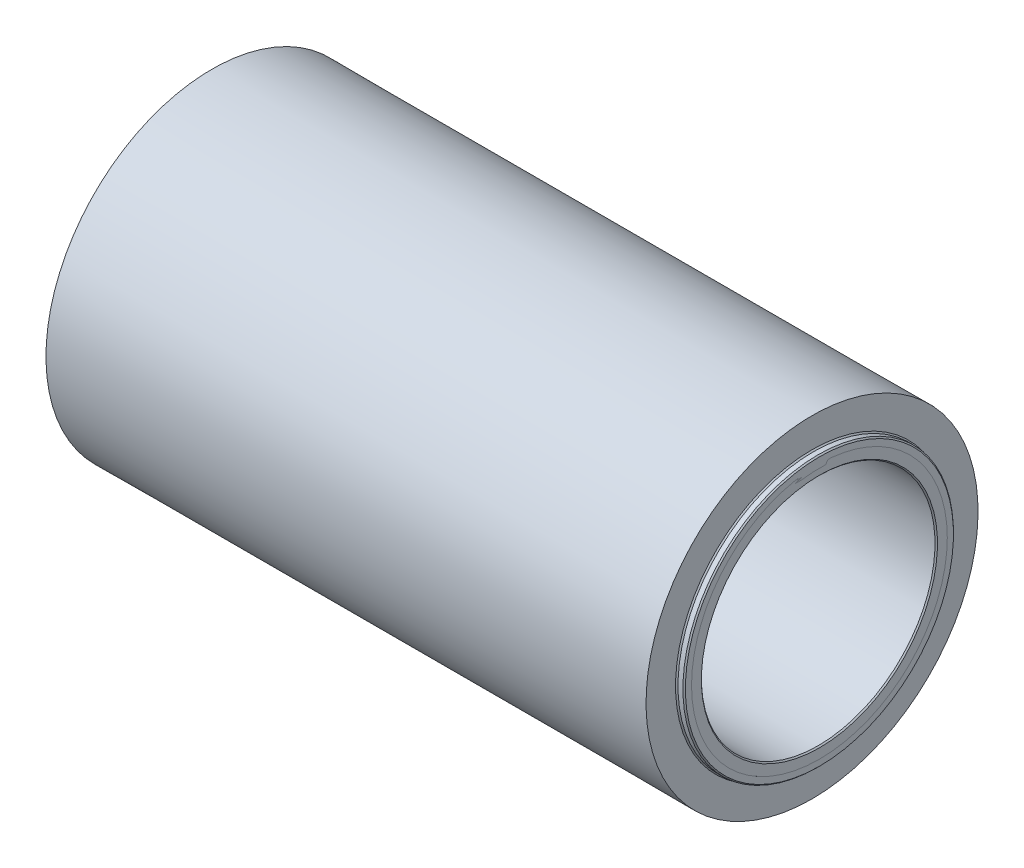
ISO-10303-21;
HEADER;
FILE_DESCRIPTION(('STEP AP214'),'2;1');
FILE_NAME('part.step','',(''),(''),'','','');
FILE_SCHEMA(('AUTOMOTIVE_DESIGN { 1 0 10303 214 1 1 1 1 }'));
ENDSEC;
DATA;
#1=APPLICATION_CONTEXT('core data for automotive mechanical design processes');
#2=APPLICATION_PROTOCOL_DEFINITION('international standard','automotive_design',2000,#1);
#3=PRODUCT_CONTEXT('',#1,'mechanical');
#4=PRODUCT('Part','Part','',(#3));
#5=PRODUCT_RELATED_PRODUCT_CATEGORY('part','',(#4));
#6=PRODUCT_DEFINITION_FORMATION('','',#4);
#7=PRODUCT_DEFINITION_CONTEXT('part definition',#1,'design');
#8=PRODUCT_DEFINITION('design','',#6,#7);
#9=PRODUCT_DEFINITION_SHAPE('','',#8);
#10=(LENGTH_UNIT() NAMED_UNIT(*) SI_UNIT(.MILLI.,.METRE.));
#11=(NAMED_UNIT(*) PLANE_ANGLE_UNIT() SI_UNIT($,.RADIAN.));
#12=(NAMED_UNIT(*) SI_UNIT($,.STERADIAN.) SOLID_ANGLE_UNIT());
#13=UNCERTAINTY_MEASURE_WITH_UNIT(LENGTH_MEASURE(1.E-05),#10,'distance_accuracy_value','');
#14=(GEOMETRIC_REPRESENTATION_CONTEXT(3) GLOBAL_UNCERTAINTY_ASSIGNED_CONTEXT((#13)) GLOBAL_UNIT_ASSIGNED_CONTEXT((#10,
#11,#12)) REPRESENTATION_CONTEXT('',''));
#15=CARTESIAN_POINT('',(0.,0.,0.));
#16=DIRECTION('',(0.,0.,1.));
#17=DIRECTION('',(1.,0.,0.));
#18=AXIS2_PLACEMENT_3D('',#15,#16,#17);
#19=CARTESIAN_POINT('',(-9.94738283618957E-05,0.000499963431931475,0.));
#20=DIRECTION('',(-0.999999999951495,9.84939010936225E-06,0.));
#21=DIRECTION('',(-9.84939010936225E-06,-0.999999999951495,0.));
#22=AXIS2_PLACEMENT_3D('',#19,#20,#21);
#23=CONICAL_SURFACE('',#22,10.0995000369476,0.785388314007278);
#24=CARTESIAN_POINT('',(0.0999015109905896,0.000498978483220625,0.));
#25=DIRECTION('',(-0.999999999951495,9.84939010936225E-06,0.));
#26=DIRECTION('',(-9.84939010936225E-06,-0.999999999951495,0.));
#27=AXIS2_PLACEMENT_3D('',#24,#25,#26);
#28=CIRCLE('',#27,9.99950102200182);
#29=CARTESIAN_POINT('',(0.0998030220041249,-9.99900204303357,0.));
#30=VERTEX_POINT('',#29);
#31=EDGE_CURVE('E104',#30,#30,#28,.T.);
#32=ORIENTED_EDGE('',*,*,#31,.F.);
#33=EDGE_LOOP('',(#32));
#34=FACE_BOUND('',#33,.T.);
#35=CARTESIAN_POINT('',(-9.94738283618957E-05,0.000499963431931475,0.));
#36=DIRECTION('',(-0.999999999951495,9.84939010936225E-06,0.));
#37=DIRECTION('',(-9.84939010936225E-06,-0.999999999951495,0.));
#38=AXIS2_PLACEMENT_3D('',#35,#36,#37);
#39=CIRCLE('',#38,10.0995000369476);
#40=CARTESIAN_POINT('',(-0.000198947744135311,-10.0990000730258,0.));
#41=VERTEX_POINT('',#40);
#42=EDGE_CURVE('E11',#41,#41,#39,.T.);
#43=ORIENTED_EDGE('',*,*,#42,.T.);
#44=EDGE_LOOP('',(#43));
#45=FACE_BOUND('',#44,.T.);
#46=ADVANCED_FACE('F45',(#34,#45),#23,.F.);
#47=CARTESIAN_POINT('',(-3.9396686253308E-06,10.0999999999284,0.));
#48=DIRECTION('',(0.999999999951495,-9.84939010936225E-06,0.));
#49=DIRECTION('',(9.84939010936225E-06,0.999999999951495,0.));
#50=AXIS2_PLACEMENT_3D('',#47,#48,#49);
#51=PLANE('',#50);
#52=ORIENTED_EDGE('',*,*,#42,.F.);
#53=EDGE_LOOP('',(#52));
#54=FACE_BOUND('',#53,.T.);
#55=CARTESIAN_POINT('',(-0.000107353340453309,0.000499963509539864,0.));
#56=DIRECTION('',(-0.999999999951495,9.84939010936225E-06,0.));
#57=DIRECTION('',(-9.84939010936225E-06,-0.999999999951495,0.));
#58=AXIS2_PLACEMENT_3D('',#55,#56,#57);
#59=CIRCLE('',#58,10.8995000369353);
#60=CARTESIAN_POINT('',(-0.000214706768314093,-10.8990000728971,0.));
#61=VERTEX_POINT('',#60);
#62=EDGE_CURVE('E52',#61,#61,#59,.T.);
#63=ORIENTED_EDGE('',*,*,#62,.T.);
#64=EDGE_LOOP('',(#63));
#65=FACE_BOUND('',#64,.T.);
#66=ADVANCED_FACE('F112',(#54,#65),#51,.F.);
#67=CARTESIAN_POINT('',(0.0998916617242079,0.000498978580229892,0.));
#68=DIRECTION('',(0.999999999951495,-9.84939010936225E-06,0.));
#69=DIRECTION('',(9.84939010936225E-06,0.999999999951495,0.));
#70=AXIS2_PLACEMENT_3D('',#67,#68,#69);
#71=CONICAL_SURFACE('',#70,10.9995010218829,0.7854080127875);
#72=ORIENTED_EDGE('',*,*,#62,.F.);
#73=EDGE_LOOP('',(#72));
#74=FACE_BOUND('',#73,.T.);
#75=CARTESIAN_POINT('',(0.0998916617242079,0.000498978580229892,0.));
#76=DIRECTION('',(-0.999999999951495,9.84939010936225E-06,0.));
#77=DIRECTION('',(-9.84939010936225E-06,-0.999999999951495,0.));
#78=AXIS2_PLACEMENT_3D('',#75,#76,#77);
#79=CIRCLE('',#78,10.9995010218829);
#80=CARTESIAN_POINT('',(0.0997833233476351,-10.9990020427691,0.));
#81=VERTEX_POINT('',#80);
#82=EDGE_CURVE('E57',#81,#81,#79,.T.);
#83=ORIENTED_EDGE('',*,*,#82,.T.);
#84=EDGE_LOOP('',(#83));
#85=FACE_BOUND('',#84,.T.);
#86=ADVANCED_FACE('F116',(#74,#85),#71,.T.);
#87=CARTESIAN_POINT('',(50.7607523510972,0.,0.));
#88=DIRECTION('',(-0.999999999951495,9.84939010936225E-06,0.));
#89=DIRECTION('',(-9.84939010936225E-06,-0.999999999951495,0.));
#90=AXIS2_PLACEMENT_3D('',#87,#88,#89);
#91=CYLINDRICAL_SURFACE('',#90,10.9995029917609);
#92=ORIENTED_EDGE('',*,*,#82,.F.);
#93=EDGE_LOOP('',(#92));
#94=FACE_BOUND('',#93,.T.);
#95=CARTESIAN_POINT('',(0.499891661685424,0.000495038824186338,0.));
#96=DIRECTION('',(-0.999999999951495,9.84939010936225E-06,0.));
#97=DIRECTION('',(-9.84939010936225E-06,-0.999999999951495,0.));
#98=AXIS2_PLACEMENT_3D('',#95,#96,#97);
#99=CIRCLE('',#98,10.9995049616389);
#100=CARTESIAN_POINT('',(0.499783323270047,-10.9990099222812,0.));
#101=VERTEX_POINT('',#100);
#102=EDGE_CURVE('E62',#101,#101,#99,.T.);
#103=ORIENTED_EDGE('',*,*,#102,.T.);
#104=EDGE_LOOP('',(#103));
#105=FACE_BOUND('',#104,.T.);
#106=ADVANCED_FACE('F121',(#94,#105),#91,.T.);
#107=CARTESIAN_POINT('',(0.5998906767367,0.000494053894876498,0.));
#108=DIRECTION('',(0.999999999951495,-9.84939010936225E-06,0.));
#109=DIRECTION('',(9.84939010936225E-06,0.999999999951495,0.));
#110=AXIS2_PLACEMENT_3D('',#107,#108,#109);
#111=CONICAL_SURFACE('',#110,11.0995059465731,0.785408012787597);
#112=ORIENTED_EDGE('',*,*,#102,.F.);
#113=EDGE_LOOP('',(#112));
#114=FACE_BOUND('',#113,.T.);
#115=CARTESIAN_POINT('',(0.5998906767367,0.000494053894876498,0.));
#116=DIRECTION('',(-0.999999999951495,9.84939010936225E-06,0.));
#117=DIRECTION('',(-9.84939010936225E-06,-0.999999999951495,0.));
#118=AXIS2_PLACEMENT_3D('',#115,#116,#117);
#119=CIRCLE('',#118,11.0995059465731);
#120=CARTESIAN_POINT('',(0.599781353372611,-11.0990118921398,0.));
#121=VERTEX_POINT('',#120);
#122=EDGE_CURVE('E68',#121,#121,#119,.T.);
#123=ORIENTED_EDGE('',*,*,#122,.T.);
#124=EDGE_LOOP('',(#123));
#125=FACE_BOUND('',#124,.T.);
#126=ADVANCED_FACE('F127',(#114,#125),#111,.T.);
#127=CARTESIAN_POINT('',(0.59986703820044,0.000494054127701663,0.));
#128=DIRECTION('',(-0.999999999951495,9.84939010936225E-06,0.));
#129=DIRECTION('',(-9.84939010936225E-06,-0.999999999951495,0.));
#130=AXIS2_PLACEMENT_3D('',#127,#128,#129);
#131=CONICAL_SURFACE('',#130,13.4995059464416,1.57078647740479);
#132=ORIENTED_EDGE('',*,*,#122,.F.);
#133=EDGE_LOOP('',(#132));
#134=FACE_BOUND('',#133,.T.);
#135=CARTESIAN_POINT('',(0.59986703820044,0.000494054127701663,0.));
#136=DIRECTION('',(-0.999999999951495,9.84939010936225E-06,0.));
#137=DIRECTION('',(-9.84939010936225E-06,-0.999999999951495,0.));
#138=AXIS2_PLACEMENT_3D('',#135,#136,#137);
#139=CIRCLE('',#138,13.4995059464416);
#140=CARTESIAN_POINT('',(0.59973407630009,-13.4990118916591,0.));
#141=VERTEX_POINT('',#140);
#142=EDGE_CURVE('E72',#141,#141,#139,.T.);
#143=ORIENTED_EDGE('',*,*,#142,.T.);
#144=EDGE_LOOP('',(#143));
#145=FACE_BOUND('',#144,.T.);
#146=ADVANCED_FACE('F131',(#134,#145),#131,.F.);
#147=CARTESIAN_POINT('',(49.3998670332606,1.34038903901256E-05,0.));
#148=DIRECTION('',(0.999999999951495,-9.84939010936225E-06,0.));
#149=DIRECTION('',(9.84939010936225E-06,0.999999999951495,0.));
#150=AXIS2_PLACEMENT_3D('',#147,#148,#149);
#151=CONICAL_SURFACE('',#150,13.4999865966789,9.8493901095262E-06);
#152=ORIENTED_EDGE('',*,*,#142,.F.);
#153=EDGE_LOOP('',(#152));
#154=FACE_BOUND('',#153,.T.);
#155=CARTESIAN_POINT('',(49.3998670332606,1.34038903901256E-05,0.));
#156=DIRECTION('',(-0.999999999951495,9.84939010936225E-06,0.));
#157=DIRECTION('',(-9.84939010936225E-06,-0.999999999951495,0.));
#158=AXIS2_PLACEMENT_3D('',#155,#156,#157);
#159=CIRCLE('',#158,13.4999865966789);
#160=CARTESIAN_POINT('',(49.3997340666262,-13.4999731921337,0.));
#161=VERTEX_POINT('',#160);
#162=EDGE_CURVE('E76',#161,#161,#159,.T.);
#163=ORIENTED_EDGE('',*,*,#162,.T.);
#164=EDGE_LOOP('',(#163));
#165=FACE_BOUND('',#164,.T.);
#166=ADVANCED_FACE('F135',(#154,#165),#151,.T.);
#167=CARTESIAN_POINT('',(49.3998906717969,1.34036575649603E-05,0.));
#168=DIRECTION('',(-0.999999999951495,9.84939010936225E-06,0.));
#169=DIRECTION('',(-9.84939010936225E-06,-0.999999999951495,0.));
#170=AXIS2_PLACEMENT_3D('',#167,#168,#169);
#171=CONICAL_SURFACE('',#170,11.0999865967953,1.57078647740479);
#172=ORIENTED_EDGE('',*,*,#162,.F.);
#173=EDGE_LOOP('',(#172));
#174=FACE_BOUND('',#173,.T.);
#175=CARTESIAN_POINT('',(49.3998906717969,1.34036575649603E-05,0.));
#176=DIRECTION('',(-0.999999999951495,9.84939010936225E-06,0.));
#177=DIRECTION('',(-9.84939010936225E-06,-0.999999999951495,0.));
#178=AXIS2_PLACEMENT_3D('',#175,#176,#177);
#179=CIRCLE('',#178,11.0999865967953);
#180=CARTESIAN_POINT('',(49.3997813436987,-11.0999731925994,0.));
#181=VERTEX_POINT('',#180);
#182=EDGE_CURVE('E80',#181,#181,#179,.T.);
#183=ORIENTED_EDGE('',*,*,#182,.T.);
#184=EDGE_LOOP('',(#183));
#185=FACE_BOUND('',#184,.T.);
#186=ADVANCED_FACE('F139',(#174,#185),#171,.T.);
#187=CARTESIAN_POINT('',(49.4998916567262,1.24187088530233E-05,0.));
#188=DIRECTION('',(-0.999999999951495,9.84939010936225E-06,0.));
#189=DIRECTION('',(-9.84939010936225E-06,-0.999999999951495,0.));
#190=AXIS2_PLACEMENT_3D('',#187,#188,#189);
#191=CONICAL_SURFACE('',#190,10.9999875817392,0.785388314007306);
#192=ORIENTED_EDGE('',*,*,#182,.F.);
#193=EDGE_LOOP('',(#192));
#194=FACE_BOUND('',#193,.T.);
#195=CARTESIAN_POINT('',(49.4998916567262,1.24187088530233E-05,0.));
#196=DIRECTION('',(-0.999999999951495,9.84939010936225E-06,0.));
#197=DIRECTION('',(-9.84939010936225E-06,-0.999999999951495,0.));
#198=AXIS2_PLACEMENT_3D('',#195,#196,#197);
#199=CIRCLE('',#198,10.9999875817392);
#200=CARTESIAN_POINT('',(49.4997833135573,-10.9999751624968,0.));
#201=VERTEX_POINT('',#200);
#202=EDGE_CURVE('E84',#201,#201,#199,.T.);
#203=ORIENTED_EDGE('',*,*,#202,.T.);
#204=EDGE_LOOP('',(#203));
#205=FACE_BOUND('',#204,.T.);
#206=ADVANCED_FACE('F143',(#194,#205),#191,.T.);
#207=CARTESIAN_POINT('',(50.7607523510972,0.,0.));
#208=DIRECTION('',(-0.999999999951495,9.84939010936225E-06,0.));
#209=DIRECTION('',(-9.84939010936225E-06,-0.999999999951495,0.));
#210=AXIS2_PLACEMENT_3D('',#207,#208,#209);
#211=CYLINDRICAL_SURFACE('',#210,10.9999895516172);
#212=ORIENTED_EDGE('',*,*,#202,.F.);
#213=EDGE_LOOP('',(#212));
#214=FACE_BOUND('',#213,.T.);
#215=CARTESIAN_POINT('',(49.8998916566874,8.47895280946936E-06,0.));
#216=DIRECTION('',(-0.999999999951495,9.84939010936225E-06,0.));
#217=DIRECTION('',(-9.84939010936225E-06,-0.999999999951495,0.));
#218=AXIS2_PLACEMENT_3D('',#215,#216,#217);
#219=CIRCLE('',#218,10.9999915214953);
#220=CARTESIAN_POINT('',(49.8997833134797,-10.9999830420089,0.));
#221=VERTEX_POINT('',#220);
#222=EDGE_CURVE('E88',#221,#221,#219,.T.);
#223=ORIENTED_EDGE('',*,*,#222,.T.);
#224=EDGE_LOOP('',(#223));
#225=FACE_BOUND('',#224,.T.);
#226=ADVANCED_FACE('F147',(#214,#225),#211,.T.);
#227=CARTESIAN_POINT('',(49.9998926416167,7.49400409753247E-06,0.));
#228=DIRECTION('',(-0.999999999951495,9.84939010936225E-06,0.));
#229=DIRECTION('',(-9.84939010936225E-06,-0.999999999951495,0.));
#230=AXIS2_PLACEMENT_3D('',#227,#228,#229);
#231=CONICAL_SURFACE('',#230,10.8999925064391,0.785388314007341);
#232=ORIENTED_EDGE('',*,*,#222,.F.);
#233=EDGE_LOOP('',(#232));
#234=FACE_BOUND('',#233,.T.);
#235=CARTESIAN_POINT('',(49.9998926416167,7.49400409753247E-06,0.));
#236=DIRECTION('',(-0.999999999951495,9.84939010936225E-06,0.));
#237=DIRECTION('',(-9.84939010936225E-06,-0.999999999951495,0.));
#238=AXIS2_PLACEMENT_3D('',#235,#236,#237);
#239=CIRCLE('',#238,10.8999925064391);
#240=CARTESIAN_POINT('',(49.9997852833383,-10.8999850119063,0.));
#241=VERTEX_POINT('',#240);
#242=EDGE_CURVE('E92',#241,#241,#239,.T.);
#243=ORIENTED_EDGE('',*,*,#242,.T.);
#244=EDGE_LOOP('',(#243));
#245=FACE_BOUND('',#244,.T.);
#246=ADVANCED_FACE('F151',(#234,#245),#231,.T.);
#247=CARTESIAN_POINT('',(50.0000039396511,10.8999999998757,0.));
#248=DIRECTION('',(-0.999999999951495,9.84939010936225E-06,0.));
#249=DIRECTION('',(-9.84939010936225E-06,-0.999999999951495,0.));
#250=AXIS2_PLACEMENT_3D('',#247,#248,#249);
#251=PLANE('',#250);
#252=ORIENTED_EDGE('',*,*,#242,.F.);
#253=EDGE_LOOP('',(#252));
#254=FACE_BOUND('',#253,.T.);
#255=CARTESIAN_POINT('',(49.9999005211288,7.49392648914405E-06,0.));
#256=DIRECTION('',(-0.999999999951495,9.84939010936225E-06,0.));
#257=DIRECTION('',(-9.84939010936225E-06,-0.999999999951495,0.));
#258=AXIS2_PLACEMENT_3D('',#255,#256,#257);
#259=CIRCLE('',#258,10.0999925064815);
#260=CARTESIAN_POINT('',(49.9998010423625,-10.0999850120651,0.));
#261=VERTEX_POINT('',#260);
#262=EDGE_CURVE('E96',#261,#261,#259,.T.);
#263=ORIENTED_EDGE('',*,*,#262,.T.);
#264=EDGE_LOOP('',(#263));
#265=FACE_BOUND('',#264,.T.);
#266=ADVANCED_FACE('F155',(#254,#265),#251,.F.);
#267=CARTESIAN_POINT('',(49.8999015061595,8.47885579817684E-06,0.));
#268=DIRECTION('',(0.999999999951495,-9.84939010936225E-06,0.));
#269=DIRECTION('',(9.84939010936225E-06,0.999999999951495,0.));
#270=AXIS2_PLACEMENT_3D('',#267,#268,#269);
#271=CONICAL_SURFACE('',#270,9.99999152162926,0.78540801278757);
#272=ORIENTED_EDGE('',*,*,#262,.F.);
#273=EDGE_LOOP('',(#272));
#274=FACE_BOUND('',#273,.T.);
#275=CARTESIAN_POINT('',(49.8999015061595,8.47885579817684E-06,0.));
#276=DIRECTION('',(-0.999999999951495,9.84939010936225E-06,0.));
#277=DIRECTION('',(-9.84939010936225E-06,-0.999999999951495,0.));
#278=AXIS2_PLACEMENT_3D('',#275,#276,#277);
#279=CIRCLE('',#278,9.99999152162926);
#280=CARTESIAN_POINT('',(49.8998030123419,-9.99998304228841,0.));
#281=VERTEX_POINT('',#280);
#282=EDGE_CURVE('E100',#281,#281,#279,.T.);
#283=ORIENTED_EDGE('',*,*,#282,.T.);
#284=EDGE_LOOP('',(#283));
#285=FACE_BOUND('',#284,.T.);
#286=ADVANCED_FACE('F159',(#274,#285),#271,.F.);
#287=CARTESIAN_POINT('',(0.0999015109905896,0.000498978483220625,0.));
#288=DIRECTION('',(0.999999999951495,-9.84939010936225E-06,0.));
#289=DIRECTION('',(9.84939010936225E-06,0.999999999951495,0.));
#290=AXIS2_PLACEMENT_3D('',#287,#288,#289);
#291=CONICAL_SURFACE('',#290,9.99950102200181,9.84939010944457E-06);
#292=ORIENTED_EDGE('',*,*,#282,.F.);
#293=EDGE_LOOP('',(#292));
#294=FACE_BOUND('',#293,.T.);
#295=ORIENTED_EDGE('',*,*,#31,.T.);
#296=EDGE_LOOP('',(#295));
#297=FACE_BOUND('',#296,.T.);
#298=ADVANCED_FACE('F109',(#294,#297),#291,.F.);
#299=CLOSED_SHELL('',(#46,#66,#86,#106,#126,#146,#166,#186,#206,#226,#246,#266,#286,#298));
#300=MANIFOLD_SOLID_BREP('B2',#299);
#301=CARTESIAN_POINT('',(25.2,10.,0.));
#302=DIRECTION('',(1.,0.,0.));
#303=DIRECTION('',(0.,1.,0.));
#304=AXIS2_PLACEMENT_3D('',#301,#302,#303);
#305=PLANE('',#304);
#306=CARTESIAN_POINT('',(25.2,0.,0.));
#307=DIRECTION('',(1.,0.,0.));
#308=DIRECTION('',(0.,1.,0.));
#309=AXIS2_PLACEMENT_3D('',#306,#307,#308);
#310=CIRCLE('',#309,10.4);
#311=CARTESIAN_POINT('',(25.2,10.4,0.));
#312=VERTEX_POINT('',#311);
#313=EDGE_CURVE('E44',#312,#312,#310,.T.);
#314=ORIENTED_EDGE('',*,*,#313,.T.);
#315=EDGE_LOOP('',(#314));
#316=FACE_BOUND('',#315,.T.);
#317=CARTESIAN_POINT('',(25.2,0.,0.));
#318=DIRECTION('',(1.,0.,0.));
#319=DIRECTION('',(0.,1.,0.));
#320=AXIS2_PLACEMENT_3D('',#317,#318,#319);
#321=CIRCLE('',#320,10.);
#322=CARTESIAN_POINT('',(25.2,10.,0.));
#323=VERTEX_POINT('',#322);
#324=EDGE_CURVE('E332',#323,#323,#321,.T.);
#325=ORIENTED_EDGE('',*,*,#324,.F.);
#326=EDGE_LOOP('',(#325));
#327=FACE_BOUND('',#326,.T.);
#328=ADVANCED_FACE('F271',(#316,#327),#305,.T.);
#329=CARTESIAN_POINT('',(25.2,0.,0.));
#330=DIRECTION('',(-1.,0.,0.));
#331=DIRECTION('',(0.,-1.,0.));
#332=AXIS2_PLACEMENT_3D('',#329,#330,#331);
#333=CONICAL_SURFACE('',#332,10.4,0.785398163397466);
#334=CARTESIAN_POINT('',(25.1,0.,0.));
#335=DIRECTION('',(1.,0.,0.));
#336=DIRECTION('',(0.,1.,0.));
#337=AXIS2_PLACEMENT_3D('',#334,#335,#336);
#338=CIRCLE('',#337,10.5);
#339=CARTESIAN_POINT('',(25.1,10.5,0.));
#340=VERTEX_POINT('',#339);
#341=EDGE_CURVE('E277',#340,#340,#338,.T.);
#342=ORIENTED_EDGE('',*,*,#341,.T.);
#343=EDGE_LOOP('',(#342));
#344=FACE_BOUND('',#343,.T.);
#345=ORIENTED_EDGE('',*,*,#313,.F.);
#346=EDGE_LOOP('',(#345));
#347=FACE_BOUND('',#346,.T.);
#348=ADVANCED_FACE('F340',(#344,#347),#333,.T.);
#349=CARTESIAN_POINT('',(0.,0.,0.));
#350=DIRECTION('',(1.,0.,0.));
#351=DIRECTION('',(0.,1.,0.));
#352=AXIS2_PLACEMENT_3D('',#349,#350,#351);
#353=CYLINDRICAL_SURFACE('',#352,10.5);
#354=CARTESIAN_POINT('',(4.89999999999999,0.,0.));
#355=DIRECTION('',(1.,0.,0.));
#356=DIRECTION('',(0.,1.,0.));
#357=AXIS2_PLACEMENT_3D('',#354,#355,#356);
#358=CIRCLE('',#357,10.5);
#359=CARTESIAN_POINT('',(4.89999999999999,10.5,0.));
#360=VERTEX_POINT('',#359);
#361=EDGE_CURVE('E281',#360,#360,#358,.T.);
#362=ORIENTED_EDGE('',*,*,#361,.T.);
#363=EDGE_LOOP('',(#362));
#364=FACE_BOUND('',#363,.T.);
#365=ORIENTED_EDGE('',*,*,#341,.F.);
#366=EDGE_LOOP('',(#365));
#367=FACE_BOUND('',#366,.T.);
#368=ADVANCED_FACE('F344',(#364,#367),#353,.T.);
#369=CARTESIAN_POINT('',(4.89999999999999,0.,0.));
#370=DIRECTION('',(1.,0.,0.));
#371=DIRECTION('',(0.,1.,0.));
#372=AXIS2_PLACEMENT_3D('',#369,#370,#371);
#373=CONICAL_SURFACE('',#372,10.5,0.78539816339744);
#374=CARTESIAN_POINT('',(4.8,0.,0.));
#375=DIRECTION('',(1.,0.,0.));
#376=DIRECTION('',(0.,1.,0.));
#377=AXIS2_PLACEMENT_3D('',#374,#375,#376);
#378=CIRCLE('',#377,10.4);
#379=CARTESIAN_POINT('',(4.8,10.4,0.));
#380=VERTEX_POINT('',#379);
#381=EDGE_CURVE('E285',#380,#380,#378,.T.);
#382=ORIENTED_EDGE('',*,*,#381,.T.);
#383=EDGE_LOOP('',(#382));
#384=FACE_BOUND('',#383,.T.);
#385=ORIENTED_EDGE('',*,*,#361,.F.);
#386=EDGE_LOOP('',(#385));
#387=FACE_BOUND('',#386,.T.);
#388=ADVANCED_FACE('F348',(#384,#387),#373,.T.);
#389=CARTESIAN_POINT('',(4.8,10.4,0.));
#390=DIRECTION('',(-1.,0.,0.));
#391=DIRECTION('',(0.,-1.,0.));
#392=AXIS2_PLACEMENT_3D('',#389,#390,#391);
#393=PLANE('',#392);
#394=CARTESIAN_POINT('',(4.8,0.,0.));
#395=DIRECTION('',(1.,0.,0.));
#396=DIRECTION('',(0.,1.,0.));
#397=AXIS2_PLACEMENT_3D('',#394,#395,#396);
#398=CIRCLE('',#397,10.);
#399=CARTESIAN_POINT('',(4.8,10.,0.));
#400=VERTEX_POINT('',#399);
#401=EDGE_CURVE('E290',#400,#400,#398,.T.);
#402=ORIENTED_EDGE('',*,*,#401,.T.);
#403=EDGE_LOOP('',(#402));
#404=FACE_BOUND('',#403,.T.);
#405=ORIENTED_EDGE('',*,*,#381,.F.);
#406=EDGE_LOOP('',(#405));
#407=FACE_BOUND('',#406,.T.);
#408=ADVANCED_FACE('F355',(#404,#407),#393,.T.);
#409=CARTESIAN_POINT('',(0.,0.,0.));
#410=DIRECTION('',(1.,0.,0.));
#411=DIRECTION('',(0.,1.,0.));
#412=AXIS2_PLACEMENT_3D('',#409,#410,#411);
#413=CYLINDRICAL_SURFACE('',#412,10.);
#414=CARTESIAN_POINT('',(3.5,0.,0.));
#415=DIRECTION('',(1.,0.,0.));
#416=DIRECTION('',(0.,1.,0.));
#417=AXIS2_PLACEMENT_3D('',#414,#415,#416);
#418=CIRCLE('',#417,10.);
#419=CARTESIAN_POINT('',(3.5,10.,0.));
#420=VERTEX_POINT('',#419);
#421=EDGE_CURVE('E293',#420,#420,#418,.T.);
#422=ORIENTED_EDGE('',*,*,#421,.T.);
#423=EDGE_LOOP('',(#422));
#424=FACE_BOUND('',#423,.T.);
#425=ORIENTED_EDGE('',*,*,#401,.F.);
#426=EDGE_LOOP('',(#425));
#427=FACE_BOUND('',#426,.T.);
#428=ADVANCED_FACE('F359',(#424,#427),#413,.T.);
#429=CARTESIAN_POINT('',(3.5,10.,0.));
#430=DIRECTION('',(1.,0.,0.));
#431=DIRECTION('',(0.,1.,0.));
#432=AXIS2_PLACEMENT_3D('',#429,#430,#431);
#433=PLANE('',#432);
#434=CARTESIAN_POINT('',(3.5,0.,0.));
#435=DIRECTION('',(1.,0.,0.));
#436=DIRECTION('',(0.,1.,0.));
#437=AXIS2_PLACEMENT_3D('',#434,#435,#436);
#438=CIRCLE('',#437,10.4);
#439=CARTESIAN_POINT('',(3.5,10.4,0.));
#440=VERTEX_POINT('',#439);
#441=EDGE_CURVE('E296',#440,#440,#438,.T.);
#442=ORIENTED_EDGE('',*,*,#441,.T.);
#443=EDGE_LOOP('',(#442));
#444=FACE_BOUND('',#443,.T.);
#445=ORIENTED_EDGE('',*,*,#421,.F.);
#446=EDGE_LOOP('',(#445));
#447=FACE_BOUND('',#446,.T.);
#448=ADVANCED_FACE('F363',(#444,#447),#433,.T.);
#449=CARTESIAN_POINT('',(3.5,0.,0.));
#450=DIRECTION('',(-1.,0.,0.));
#451=DIRECTION('',(0.,-1.,0.));
#452=AXIS2_PLACEMENT_3D('',#449,#450,#451);
#453=CONICAL_SURFACE('',#452,10.4,0.785398163397446);
#454=CARTESIAN_POINT('',(3.4,0.,0.));
#455=DIRECTION('',(1.,0.,0.));
#456=DIRECTION('',(0.,1.,0.));
#457=AXIS2_PLACEMENT_3D('',#454,#455,#456);
#458=CIRCLE('',#457,10.5);
#459=CARTESIAN_POINT('',(3.4,10.5,0.));
#460=VERTEX_POINT('',#459);
#461=EDGE_CURVE('E299',#460,#460,#458,.T.);
#462=ORIENTED_EDGE('',*,*,#461,.T.);
#463=EDGE_LOOP('',(#462));
#464=FACE_BOUND('',#463,.T.);
#465=ORIENTED_EDGE('',*,*,#441,.F.);
#466=EDGE_LOOP('',(#465));
#467=FACE_BOUND('',#466,.T.);
#468=ADVANCED_FACE('F367',(#464,#467),#453,.T.);
#469=CARTESIAN_POINT('',(0.,0.,0.));
#470=DIRECTION('',(1.,0.,0.));
#471=DIRECTION('',(0.,1.,0.));
#472=AXIS2_PLACEMENT_3D('',#469,#470,#471);
#473=CYLINDRICAL_SURFACE('',#472,10.5);
#474=CARTESIAN_POINT('',(0.099999999999995,0.,0.));
#475=DIRECTION('',(1.,0.,0.));
#476=DIRECTION('',(0.,1.,0.));
#477=AXIS2_PLACEMENT_3D('',#474,#475,#476);
#478=CIRCLE('',#477,10.5);
#479=CARTESIAN_POINT('',(0.0999999999999942,10.5,0.));
#480=VERTEX_POINT('',#479);
#481=EDGE_CURVE('E302',#480,#480,#478,.T.);
#482=ORIENTED_EDGE('',*,*,#481,.T.);
#483=EDGE_LOOP('',(#482));
#484=FACE_BOUND('',#483,.T.);
#485=ORIENTED_EDGE('',*,*,#461,.F.);
#486=EDGE_LOOP('',(#485));
#487=FACE_BOUND('',#486,.T.);
#488=ADVANCED_FACE('F371',(#484,#487),#473,.T.);
#489=CARTESIAN_POINT('',(0.099999999999995,0.,0.));
#490=DIRECTION('',(1.,0.,0.));
#491=DIRECTION('',(0.,1.,0.));
#492=AXIS2_PLACEMENT_3D('',#489,#490,#491);
#493=CONICAL_SURFACE('',#492,10.5,0.785398163397454);
#494=CARTESIAN_POINT('',(0.,0.,0.));
#495=DIRECTION('',(1.,0.,0.));
#496=DIRECTION('',(0.,1.,0.));
#497=AXIS2_PLACEMENT_3D('',#494,#495,#496);
#498=CIRCLE('',#497,10.4);
#499=CARTESIAN_POINT('',(0.,10.4,0.));
#500=VERTEX_POINT('',#499);
#501=EDGE_CURVE('E305',#500,#500,#498,.T.);
#502=ORIENTED_EDGE('',*,*,#501,.T.);
#503=EDGE_LOOP('',(#502));
#504=FACE_BOUND('',#503,.T.);
#505=ORIENTED_EDGE('',*,*,#481,.F.);
#506=EDGE_LOOP('',(#505));
#507=FACE_BOUND('',#506,.T.);
#508=ADVANCED_FACE('F375',(#504,#507),#493,.T.);
#509=CARTESIAN_POINT('',(0.,10.4,0.));
#510=DIRECTION('',(-1.,0.,0.));
#511=DIRECTION('',(0.,-1.,0.));
#512=AXIS2_PLACEMENT_3D('',#509,#510,#511);
#513=PLANE('',#512);
#514=CARTESIAN_POINT('',(0.,0.,0.));
#515=DIRECTION('',(1.,0.,0.));
#516=DIRECTION('',(0.,1.,0.));
#517=AXIS2_PLACEMENT_3D('',#514,#515,#516);
#518=CIRCLE('',#517,9.50000000000001);
#519=CARTESIAN_POINT('',(0.,9.5,0.));
#520=VERTEX_POINT('',#519);
#521=EDGE_CURVE('E308',#520,#520,#518,.T.);
#522=ORIENTED_EDGE('',*,*,#521,.T.);
#523=EDGE_LOOP('',(#522));
#524=FACE_BOUND('',#523,.T.);
#525=ORIENTED_EDGE('',*,*,#501,.F.);
#526=EDGE_LOOP('',(#525));
#527=FACE_BOUND('',#526,.T.);
#528=ADVANCED_FACE('F379',(#524,#527),#513,.T.);
#529=CARTESIAN_POINT('',(0.,0.,0.));
#530=DIRECTION('',(1.,0.,0.));
#531=DIRECTION('',(0.,1.,0.));
#532=AXIS2_PLACEMENT_3D('',#529,#530,#531);
#533=CYLINDRICAL_SURFACE('',#532,9.5);
#534=CARTESIAN_POINT('',(49.9,0.,0.));
#535=DIRECTION('',(1.,0.,0.));
#536=DIRECTION('',(0.,1.,0.));
#537=AXIS2_PLACEMENT_3D('',#534,#535,#536);
#538=CIRCLE('',#537,9.5);
#539=CARTESIAN_POINT('',(49.9,9.5,0.));
#540=VERTEX_POINT('',#539);
#541=EDGE_CURVE('E311',#540,#540,#538,.T.);
#542=ORIENTED_EDGE('',*,*,#541,.T.);
#543=EDGE_LOOP('',(#542));
#544=FACE_BOUND('',#543,.T.);
#545=ORIENTED_EDGE('',*,*,#521,.F.);
#546=EDGE_LOOP('',(#545));
#547=FACE_BOUND('',#546,.T.);
#548=ADVANCED_FACE('F383',(#544,#547),#533,.F.);
#549=CARTESIAN_POINT('',(49.9,0.,0.));
#550=DIRECTION('',(1.,0.,0.));
#551=DIRECTION('',(0.,1.,0.));
#552=AXIS2_PLACEMENT_3D('',#549,#550,#551);
#553=CONICAL_SURFACE('',#552,9.5,0.785398163397448);
#554=CARTESIAN_POINT('',(50.,0.,0.));
#555=DIRECTION('',(1.,0.,0.));
#556=DIRECTION('',(0.,1.,0.));
#557=AXIS2_PLACEMENT_3D('',#554,#555,#556);
#558=CIRCLE('',#557,9.6);
#559=CARTESIAN_POINT('',(50.,9.6,0.));
#560=VERTEX_POINT('',#559);
#561=EDGE_CURVE('E314',#560,#560,#558,.T.);
#562=ORIENTED_EDGE('',*,*,#561,.T.);
#563=EDGE_LOOP('',(#562));
#564=FACE_BOUND('',#563,.T.);
#565=ORIENTED_EDGE('',*,*,#541,.F.);
#566=EDGE_LOOP('',(#565));
#567=FACE_BOUND('',#566,.T.);
#568=ADVANCED_FACE('F387',(#564,#567),#553,.F.);
#569=CARTESIAN_POINT('',(50.,9.6,0.));
#570=DIRECTION('',(1.,0.,0.));
#571=DIRECTION('',(0.,1.,0.));
#572=AXIS2_PLACEMENT_3D('',#569,#570,#571);
#573=PLANE('',#572);
#574=CARTESIAN_POINT('',(50.,0.,0.));
#575=DIRECTION('',(1.,0.,0.));
#576=DIRECTION('',(0.,1.,0.));
#577=AXIS2_PLACEMENT_3D('',#574,#575,#576);
#578=CIRCLE('',#577,10.4);
#579=CARTESIAN_POINT('',(50.,10.4,0.));
#580=VERTEX_POINT('',#579);
#581=EDGE_CURVE('E317',#580,#580,#578,.T.);
#582=ORIENTED_EDGE('',*,*,#581,.T.);
#583=EDGE_LOOP('',(#582));
#584=FACE_BOUND('',#583,.T.);
#585=ORIENTED_EDGE('',*,*,#561,.F.);
#586=EDGE_LOOP('',(#585));
#587=FACE_BOUND('',#586,.T.);
#588=ADVANCED_FACE('F391',(#584,#587),#573,.T.);
#589=CARTESIAN_POINT('',(50.,0.,0.));
#590=DIRECTION('',(-1.,0.,0.));
#591=DIRECTION('',(0.,-1.,0.));
#592=AXIS2_PLACEMENT_3D('',#589,#590,#591);
#593=CONICAL_SURFACE('',#592,10.4,0.78539816339744);
#594=CARTESIAN_POINT('',(49.9,0.,0.));
#595=DIRECTION('',(1.,0.,0.));
#596=DIRECTION('',(0.,1.,0.));
#597=AXIS2_PLACEMENT_3D('',#594,#595,#596);
#598=CIRCLE('',#597,10.5);
#599=CARTESIAN_POINT('',(49.9,10.5,0.));
#600=VERTEX_POINT('',#599);
#601=EDGE_CURVE('E320',#600,#600,#598,.T.);
#602=ORIENTED_EDGE('',*,*,#601,.T.);
#603=EDGE_LOOP('',(#602));
#604=FACE_BOUND('',#603,.T.);
#605=ORIENTED_EDGE('',*,*,#581,.F.);
#606=EDGE_LOOP('',(#605));
#607=FACE_BOUND('',#606,.T.);
#608=ADVANCED_FACE('F395',(#604,#607),#593,.T.);
#609=CARTESIAN_POINT('',(0.,0.,0.));
#610=DIRECTION('',(1.,0.,0.));
#611=DIRECTION('',(0.,1.,0.));
#612=AXIS2_PLACEMENT_3D('',#609,#610,#611);
#613=CYLINDRICAL_SURFACE('',#612,10.5);
#614=CARTESIAN_POINT('',(46.6,0.,0.));
#615=DIRECTION('',(1.,0.,0.));
#616=DIRECTION('',(0.,1.,0.));
#617=AXIS2_PLACEMENT_3D('',#614,#615,#616);
#618=CIRCLE('',#617,10.5);
#619=CARTESIAN_POINT('',(46.6,10.5,0.));
#620=VERTEX_POINT('',#619);
#621=EDGE_CURVE('E323',#620,#620,#618,.T.);
#622=ORIENTED_EDGE('',*,*,#621,.T.);
#623=EDGE_LOOP('',(#622));
#624=FACE_BOUND('',#623,.T.);
#625=ORIENTED_EDGE('',*,*,#601,.F.);
#626=EDGE_LOOP('',(#625));
#627=FACE_BOUND('',#626,.T.);
#628=ADVANCED_FACE('F399',(#624,#627),#613,.T.);
#629=CARTESIAN_POINT('',(46.6,0.,0.));
#630=DIRECTION('',(1.,0.,0.));
#631=DIRECTION('',(0.,1.,0.));
#632=AXIS2_PLACEMENT_3D('',#629,#630,#631);
#633=CONICAL_SURFACE('',#632,10.5,0.785398163397466);
#634=CARTESIAN_POINT('',(46.5,0.,0.));
#635=DIRECTION('',(1.,0.,0.));
#636=DIRECTION('',(0.,1.,0.));
#637=AXIS2_PLACEMENT_3D('',#634,#635,#636);
#638=CIRCLE('',#637,10.4);
#639=CARTESIAN_POINT('',(46.5,10.4,0.));
#640=VERTEX_POINT('',#639);
#641=EDGE_CURVE('E326',#640,#640,#638,.T.);
#642=ORIENTED_EDGE('',*,*,#641,.T.);
#643=EDGE_LOOP('',(#642));
#644=FACE_BOUND('',#643,.T.);
#645=ORIENTED_EDGE('',*,*,#621,.F.);
#646=EDGE_LOOP('',(#645));
#647=FACE_BOUND('',#646,.T.);
#648=ADVANCED_FACE('F403',(#644,#647),#633,.T.);
#649=CARTESIAN_POINT('',(46.5,10.4,0.));
#650=DIRECTION('',(-1.,0.,0.));
#651=DIRECTION('',(0.,-1.,0.));
#652=AXIS2_PLACEMENT_3D('',#649,#650,#651);
#653=PLANE('',#652);
#654=CARTESIAN_POINT('',(46.5,0.,0.));
#655=DIRECTION('',(1.,0.,0.));
#656=DIRECTION('',(0.,1.,0.));
#657=AXIS2_PLACEMENT_3D('',#654,#655,#656);
#658=CIRCLE('',#657,10.);
#659=CARTESIAN_POINT('',(46.5,10.,0.));
#660=VERTEX_POINT('',#659);
#661=EDGE_CURVE('E329',#660,#660,#658,.T.);
#662=ORIENTED_EDGE('',*,*,#661,.T.);
#663=EDGE_LOOP('',(#662));
#664=FACE_BOUND('',#663,.T.);
#665=ORIENTED_EDGE('',*,*,#641,.F.);
#666=EDGE_LOOP('',(#665));
#667=FACE_BOUND('',#666,.T.);
#668=ADVANCED_FACE('F407',(#664,#667),#653,.T.);
#669=CARTESIAN_POINT('',(0.,0.,0.));
#670=DIRECTION('',(1.,0.,0.));
#671=DIRECTION('',(0.,1.,0.));
#672=AXIS2_PLACEMENT_3D('',#669,#670,#671);
#673=CYLINDRICAL_SURFACE('',#672,10.);
#674=ORIENTED_EDGE('',*,*,#324,.T.);
#675=EDGE_LOOP('',(#674));
#676=FACE_BOUND('',#675,.T.);
#677=ORIENTED_EDGE('',*,*,#661,.F.);
#678=EDGE_LOOP('',(#677));
#679=FACE_BOUND('',#678,.T.);
#680=ADVANCED_FACE('F336',(#676,#679),#673,.T.);
#681=CLOSED_SHELL('',(#328,#348,#368,#388,#408,#428,#448,#468,#488,#508,#528,#548,#568,#588,
#608,#628,#648,#668,#680));
#682=MANIFOLD_SOLID_BREP('B6',#681);
#683=ADVANCED_BREP_SHAPE_REPRESENTATION('',(#18,#300,#682),#14);
#684=SHAPE_DEFINITION_REPRESENTATION(#9,#683);
ENDSEC;
END-ISO-10303-21;
